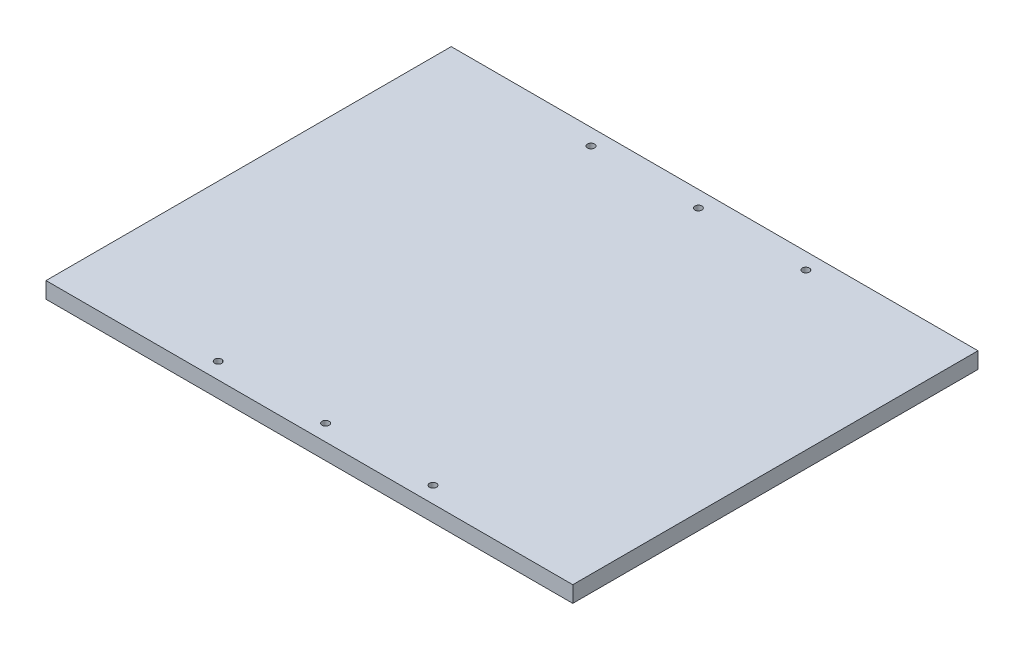
ISO-10303-21;
HEADER;
FILE_DESCRIPTION(('STEP AP214'),'2;1');
FILE_NAME('part.step','',(''),(''),'','','');
FILE_SCHEMA(('AUTOMOTIVE_DESIGN { 1 0 10303 214 1 1 1 1 }'));
ENDSEC;
DATA;
#1=APPLICATION_CONTEXT('core data for automotive mechanical design processes');
#2=APPLICATION_PROTOCOL_DEFINITION('international standard','automotive_design',2000,#1);
#3=PRODUCT_CONTEXT('',#1,'mechanical');
#4=PRODUCT('Part','Part','',(#3));
#5=PRODUCT_RELATED_PRODUCT_CATEGORY('part','',(#4));
#6=PRODUCT_DEFINITION_FORMATION('','',#4);
#7=PRODUCT_DEFINITION_CONTEXT('part definition',#1,'design');
#8=PRODUCT_DEFINITION('design','',#6,#7);
#9=PRODUCT_DEFINITION_SHAPE('','',#8);
#10=(LENGTH_UNIT() NAMED_UNIT(*) SI_UNIT(.MILLI.,.METRE.));
#11=(NAMED_UNIT(*) PLANE_ANGLE_UNIT() SI_UNIT($,.RADIAN.));
#12=(NAMED_UNIT(*) SI_UNIT($,.STERADIAN.) SOLID_ANGLE_UNIT());
#13=UNCERTAINTY_MEASURE_WITH_UNIT(LENGTH_MEASURE(1.E-05),#10,'distance_accuracy_value','');
#14=(GEOMETRIC_REPRESENTATION_CONTEXT(3) GLOBAL_UNCERTAINTY_ASSIGNED_CONTEXT((#13)) GLOBAL_UNIT_ASSIGNED_CONTEXT((#10,
#11,#12)) REPRESENTATION_CONTEXT('',''));
#15=CARTESIAN_POINT('',(0.,0.,0.));
#16=DIRECTION('',(0.,0.,1.));
#17=DIRECTION('',(1.,0.,0.));
#18=AXIS2_PLACEMENT_3D('',#15,#16,#17);
#19=CARTESIAN_POINT('',(0.,8.,0.));
#20=DIRECTION('',(0.,-1.,0.));
#21=DIRECTION('',(0.,0.,-1.));
#22=AXIS2_PLACEMENT_3D('',#19,#20,#21);
#23=PLANE('',#22);
#24=DIRECTION('',(0.,0.,-1.));
#25=VECTOR('',#24,1.);
#26=CARTESIAN_POINT('',(130.,8.,100.));
#27=LINE('',#26,#25);
#28=CARTESIAN_POINT('',(130.,8.,100.));
#29=VERTEX_POINT('',#28);
#30=CARTESIAN_POINT('',(130.,8.,-100.));
#31=VERTEX_POINT('',#30);
#32=EDGE_CURVE('E96',#29,#31,#27,.T.);
#33=ORIENTED_EDGE('',*,*,#32,.T.);
#34=DIRECTION('',(-1.,0.,0.));
#35=VECTOR('',#34,1.);
#36=CARTESIAN_POINT('',(-130.,8.,-100.));
#37=LINE('',#36,#35);
#38=CARTESIAN_POINT('',(-130.,8.,-100.));
#39=VERTEX_POINT('',#38);
#40=EDGE_CURVE('E91',#31,#39,#37,.T.);
#41=ORIENTED_EDGE('',*,*,#40,.T.);
#42=DIRECTION('',(0.,0.,1.));
#43=VECTOR('',#42,1.);
#44=CARTESIAN_POINT('',(-130.,8.,100.));
#45=LINE('',#44,#43);
#46=CARTESIAN_POINT('',(-130.,8.,100.));
#47=VERTEX_POINT('',#46);
#48=EDGE_CURVE('E94',#39,#47,#45,.T.);
#49=ORIENTED_EDGE('',*,*,#48,.T.);
#50=DIRECTION('',(1.,0.,0.));
#51=VECTOR('',#50,1.);
#52=CARTESIAN_POINT('',(-130.,8.,100.));
#53=LINE('',#52,#51);
#54=EDGE_CURVE('E61',#47,#29,#53,.T.);
#55=ORIENTED_EDGE('',*,*,#54,.T.);
#56=EDGE_LOOP('',(#33,#41,#49,#55));
#57=FACE_BOUND('',#56,.T.);
#58=CARTESIAN_POINT('',(-53.,8.,92.));
#59=DIRECTION('',(0.,1.,0.));
#60=DIRECTION('',(0.,0.,1.));
#61=AXIS2_PLACEMENT_3D('',#58,#59,#60);
#62=CIRCLE('',#61,1.75);
#63=CARTESIAN_POINT('',(-53.,8.,93.75));
#64=VERTEX_POINT('',#63);
#65=EDGE_CURVE('E116',#64,#64,#62,.T.);
#66=ORIENTED_EDGE('',*,*,#65,.F.);
#67=EDGE_LOOP('',(#66));
#68=FACE_BOUND('',#67,.T.);
#69=CARTESIAN_POINT('',(53.,8.,92.));
#70=DIRECTION('',(0.,1.,0.));
#71=DIRECTION('',(0.,0.,1.));
#72=AXIS2_PLACEMENT_3D('',#69,#70,#71);
#73=CIRCLE('',#72,1.75);
#74=CARTESIAN_POINT('',(53.,8.,93.75));
#75=VERTEX_POINT('',#74);
#76=EDGE_CURVE('E138',#75,#75,#73,.T.);
#77=ORIENTED_EDGE('',*,*,#76,.F.);
#78=EDGE_LOOP('',(#77));
#79=FACE_BOUND('',#78,.T.);
#80=CARTESIAN_POINT('',(0.,8.,92.));
#81=DIRECTION('',(0.,1.,0.));
#82=DIRECTION('',(0.,0.,1.));
#83=AXIS2_PLACEMENT_3D('',#80,#81,#82);
#84=CIRCLE('',#83,1.75);
#85=CARTESIAN_POINT('',(0.,8.,93.75));
#86=VERTEX_POINT('',#85);
#87=EDGE_CURVE('E146',#86,#86,#84,.T.);
#88=ORIENTED_EDGE('',*,*,#87,.F.);
#89=EDGE_LOOP('',(#88));
#90=FACE_BOUND('',#89,.T.);
#91=CARTESIAN_POINT('',(0.,8.,-92.));
#92=DIRECTION('',(0.,1.,0.));
#93=DIRECTION('',(0.,0.,-1.));
#94=AXIS2_PLACEMENT_3D('',#91,#92,#93);
#95=CIRCLE('',#94,1.75);
#96=CARTESIAN_POINT('',(0.,8.,-93.75));
#97=VERTEX_POINT('',#96);
#98=EDGE_CURVE('E154',#97,#97,#95,.T.);
#99=ORIENTED_EDGE('',*,*,#98,.F.);
#100=EDGE_LOOP('',(#99));
#101=FACE_BOUND('',#100,.T.);
#102=CARTESIAN_POINT('',(53.,8.,-92.));
#103=DIRECTION('',(0.,1.,0.));
#104=DIRECTION('',(0.,0.,-1.));
#105=AXIS2_PLACEMENT_3D('',#102,#103,#104);
#106=CIRCLE('',#105,1.75);
#107=CARTESIAN_POINT('',(53.,8.,-93.75));
#108=VERTEX_POINT('',#107);
#109=EDGE_CURVE('E162',#108,#108,#106,.T.);
#110=ORIENTED_EDGE('',*,*,#109,.F.);
#111=EDGE_LOOP('',(#110));
#112=FACE_BOUND('',#111,.T.);
#113=CARTESIAN_POINT('',(-53.,8.,-92.));
#114=DIRECTION('',(0.,1.,0.));
#115=DIRECTION('',(0.,0.,-1.));
#116=AXIS2_PLACEMENT_3D('',#113,#114,#115);
#117=CIRCLE('',#116,1.75);
#118=CARTESIAN_POINT('',(-53.,8.,-93.75));
#119=VERTEX_POINT('',#118);
#120=EDGE_CURVE('E170',#119,#119,#117,.T.);
#121=ORIENTED_EDGE('',*,*,#120,.F.);
#122=EDGE_LOOP('',(#121));
#123=FACE_BOUND('',#122,.T.);
#124=ADVANCED_FACE('F43',(#57,#68,#79,#90,#101,#112,#123),#23,.F.);
#125=CARTESIAN_POINT('',(0.,0.,0.));
#126=DIRECTION('',(0.,-1.,0.));
#127=DIRECTION('',(0.,0.,-1.));
#128=AXIS2_PLACEMENT_3D('',#125,#126,#127);
#129=PLANE('',#128);
#130=CARTESIAN_POINT('',(53.,0.,-92.));
#131=DIRECTION('',(0.,1.,0.));
#132=DIRECTION('',(0.,0.,-1.));
#133=AXIS2_PLACEMENT_3D('',#130,#131,#132);
#134=CIRCLE('',#133,1.75);
#135=CARTESIAN_POINT('',(53.,0.,-93.75));
#136=VERTEX_POINT('',#135);
#137=EDGE_CURVE('E166',#136,#136,#134,.T.);
#138=ORIENTED_EDGE('',*,*,#137,.T.);
#139=EDGE_LOOP('',(#138));
#140=FACE_BOUND('',#139,.T.);
#141=CARTESIAN_POINT('',(0.,0.,92.));
#142=DIRECTION('',(0.,1.,0.));
#143=DIRECTION('',(0.,0.,1.));
#144=AXIS2_PLACEMENT_3D('',#141,#142,#143);
#145=CIRCLE('',#144,1.75);
#146=CARTESIAN_POINT('',(0.,0.,93.75));
#147=VERTEX_POINT('',#146);
#148=EDGE_CURVE('E150',#147,#147,#145,.T.);
#149=ORIENTED_EDGE('',*,*,#148,.T.);
#150=EDGE_LOOP('',(#149));
#151=FACE_BOUND('',#150,.T.);
#152=CARTESIAN_POINT('',(-53.,0.,92.));
#153=DIRECTION('',(0.,1.,0.));
#154=DIRECTION('',(0.,0.,1.));
#155=AXIS2_PLACEMENT_3D('',#152,#153,#154);
#156=CIRCLE('',#155,1.75);
#157=CARTESIAN_POINT('',(-53.,0.,93.75));
#158=VERTEX_POINT('',#157);
#159=EDGE_CURVE('E134',#158,#158,#156,.T.);
#160=ORIENTED_EDGE('',*,*,#159,.T.);
#161=EDGE_LOOP('',(#160));
#162=FACE_BOUND('',#161,.T.);
#163=DIRECTION('',(0.,0.,-1.));
#164=VECTOR('',#163,1.);
#165=CARTESIAN_POINT('',(130.,0.,100.));
#166=LINE('',#165,#164);
#167=CARTESIAN_POINT('',(130.,0.,100.));
#168=VERTEX_POINT('',#167);
#169=CARTESIAN_POINT('',(130.,0.,-100.));
#170=VERTEX_POINT('',#169);
#171=EDGE_CURVE('E112',#168,#170,#166,.T.);
#172=ORIENTED_EDGE('',*,*,#171,.F.);
#173=DIRECTION('',(1.,0.,0.));
#174=VECTOR('',#173,1.);
#175=CARTESIAN_POINT('',(-130.,0.,100.));
#176=LINE('',#175,#174);
#177=CARTESIAN_POINT('',(-130.,0.,100.));
#178=VERTEX_POINT('',#177);
#179=EDGE_CURVE('E84',#178,#168,#176,.T.);
#180=ORIENTED_EDGE('',*,*,#179,.F.);
#181=DIRECTION('',(0.,0.,1.));
#182=VECTOR('',#181,1.);
#183=CARTESIAN_POINT('',(-130.,0.,100.));
#184=LINE('',#183,#182);
#185=CARTESIAN_POINT('',(-130.,0.,-100.));
#186=VERTEX_POINT('',#185);
#187=EDGE_CURVE('E78',#186,#178,#184,.T.);
#188=ORIENTED_EDGE('',*,*,#187,.F.);
#189=DIRECTION('',(-1.,0.,0.));
#190=VECTOR('',#189,1.);
#191=CARTESIAN_POINT('',(-130.,0.,-100.));
#192=LINE('',#191,#190);
#193=EDGE_CURVE('E101',#170,#186,#192,.T.);
#194=ORIENTED_EDGE('',*,*,#193,.F.);
#195=EDGE_LOOP('',(#172,#180,#188,#194));
#196=FACE_BOUND('',#195,.T.);
#197=CARTESIAN_POINT('',(53.,0.,92.));
#198=DIRECTION('',(0.,1.,0.));
#199=DIRECTION('',(0.,0.,1.));
#200=AXIS2_PLACEMENT_3D('',#197,#198,#199);
#201=CIRCLE('',#200,1.75);
#202=CARTESIAN_POINT('',(53.,0.,93.75));
#203=VERTEX_POINT('',#202);
#204=EDGE_CURVE('E142',#203,#203,#201,.T.);
#205=ORIENTED_EDGE('',*,*,#204,.T.);
#206=EDGE_LOOP('',(#205));
#207=FACE_BOUND('',#206,.T.);
#208=CARTESIAN_POINT('',(0.,0.,-92.));
#209=DIRECTION('',(0.,1.,0.));
#210=DIRECTION('',(0.,0.,-1.));
#211=AXIS2_PLACEMENT_3D('',#208,#209,#210);
#212=CIRCLE('',#211,1.75);
#213=CARTESIAN_POINT('',(0.,0.,-93.75));
#214=VERTEX_POINT('',#213);
#215=EDGE_CURVE('E158',#214,#214,#212,.T.);
#216=ORIENTED_EDGE('',*,*,#215,.T.);
#217=EDGE_LOOP('',(#216));
#218=FACE_BOUND('',#217,.T.);
#219=CARTESIAN_POINT('',(-53.,0.,-92.));
#220=DIRECTION('',(0.,1.,0.));
#221=DIRECTION('',(0.,0.,-1.));
#222=AXIS2_PLACEMENT_3D('',#219,#220,#221);
#223=CIRCLE('',#222,1.75);
#224=CARTESIAN_POINT('',(-53.,0.,-93.75));
#225=VERTEX_POINT('',#224);
#226=EDGE_CURVE('E174',#225,#225,#223,.T.);
#227=ORIENTED_EDGE('',*,*,#226,.T.);
#228=EDGE_LOOP('',(#227));
#229=FACE_BOUND('',#228,.T.);
#230=ADVANCED_FACE('F129',(#140,#151,#162,#196,#207,#218,#229),#129,.T.);
#231=CARTESIAN_POINT('',(130.,8.,100.));
#232=DIRECTION('',(-1.,0.,0.));
#233=DIRECTION('',(0.,0.,1.));
#234=AXIS2_PLACEMENT_3D('',#231,#232,#233);
#235=PLANE('',#234);
#236=ORIENTED_EDGE('',*,*,#171,.T.);
#237=DIRECTION('',(0.,-1.,0.));
#238=VECTOR('',#237,1.);
#239=CARTESIAN_POINT('',(130.,8.,-100.));
#240=LINE('',#239,#238);
#241=EDGE_CURVE('E11',#31,#170,#240,.T.);
#242=ORIENTED_EDGE('',*,*,#241,.F.);
#243=ORIENTED_EDGE('',*,*,#32,.F.);
#244=DIRECTION('',(0.,-1.,0.));
#245=VECTOR('',#244,1.);
#246=CARTESIAN_POINT('',(130.,8.,100.));
#247=LINE('',#246,#245);
#248=EDGE_CURVE('E108',#29,#168,#247,.T.);
#249=ORIENTED_EDGE('',*,*,#248,.T.);
#250=EDGE_LOOP('',(#236,#242,#243,#249));
#251=FACE_BOUND('',#250,.T.);
#252=ADVANCED_FACE('F45',(#251),#235,.F.);
#253=CARTESIAN_POINT('',(-130.,8.,-100.));
#254=DIRECTION('',(0.,0.,1.));
#255=DIRECTION('',(1.,0.,0.));
#256=AXIS2_PLACEMENT_3D('',#253,#254,#255);
#257=PLANE('',#256);
#258=ORIENTED_EDGE('',*,*,#193,.T.);
#259=DIRECTION('',(0.,-1.,0.));
#260=VECTOR('',#259,1.);
#261=CARTESIAN_POINT('',(-130.,8.,-100.));
#262=LINE('',#261,#260);
#263=EDGE_CURVE('E53',#39,#186,#262,.T.);
#264=ORIENTED_EDGE('',*,*,#263,.F.);
#265=ORIENTED_EDGE('',*,*,#40,.F.);
#266=ORIENTED_EDGE('',*,*,#241,.T.);
#267=EDGE_LOOP('',(#258,#264,#265,#266));
#268=FACE_BOUND('',#267,.T.);
#269=ADVANCED_FACE('F100',(#268),#257,.F.);
#270=CARTESIAN_POINT('',(-130.,8.,100.));
#271=DIRECTION('',(1.,0.,0.));
#272=DIRECTION('',(0.,0.,-1.));
#273=AXIS2_PLACEMENT_3D('',#270,#271,#272);
#274=PLANE('',#273);
#275=ORIENTED_EDGE('',*,*,#187,.T.);
#276=DIRECTION('',(0.,-1.,0.));
#277=VECTOR('',#276,1.);
#278=CARTESIAN_POINT('',(-130.,8.,100.));
#279=LINE('',#278,#277);
#280=EDGE_CURVE('E103',#47,#178,#279,.T.);
#281=ORIENTED_EDGE('',*,*,#280,.F.);
#282=ORIENTED_EDGE('',*,*,#48,.F.);
#283=ORIENTED_EDGE('',*,*,#263,.T.);
#284=EDGE_LOOP('',(#275,#281,#282,#283));
#285=FACE_BOUND('',#284,.T.);
#286=ADVANCED_FACE('F104',(#285),#274,.F.);
#287=CARTESIAN_POINT('',(-130.,8.,100.));
#288=DIRECTION('',(0.,0.,-1.));
#289=DIRECTION('',(-1.,0.,0.));
#290=AXIS2_PLACEMENT_3D('',#287,#288,#289);
#291=PLANE('',#290);
#292=ORIENTED_EDGE('',*,*,#179,.T.);
#293=ORIENTED_EDGE('',*,*,#248,.F.);
#294=ORIENTED_EDGE('',*,*,#54,.F.);
#295=ORIENTED_EDGE('',*,*,#280,.T.);
#296=EDGE_LOOP('',(#292,#293,#294,#295));
#297=FACE_BOUND('',#296,.T.);
#298=ADVANCED_FACE('F126',(#297),#291,.F.);
#299=CARTESIAN_POINT('',(-53.,8.,92.));
#300=DIRECTION('',(0.,-1.,0.));
#301=DIRECTION('',(0.,0.,-1.));
#302=AXIS2_PLACEMENT_3D('',#299,#300,#301);
#303=CYLINDRICAL_SURFACE('',#302,1.75);
#304=ORIENTED_EDGE('',*,*,#65,.T.);
#305=EDGE_LOOP('',(#304));
#306=FACE_BOUND('',#305,.T.);
#307=ORIENTED_EDGE('',*,*,#159,.F.);
#308=EDGE_LOOP('',(#307));
#309=FACE_BOUND('',#308,.T.);
#310=ADVANCED_FACE('F193',(#306,#309),#303,.F.);
#311=CARTESIAN_POINT('',(53.,8.,92.));
#312=DIRECTION('',(0.,-1.,0.));
#313=DIRECTION('',(0.,0.,-1.));
#314=AXIS2_PLACEMENT_3D('',#311,#312,#313);
#315=CYLINDRICAL_SURFACE('',#314,1.75);
#316=ORIENTED_EDGE('',*,*,#76,.T.);
#317=EDGE_LOOP('',(#316));
#318=FACE_BOUND('',#317,.T.);
#319=ORIENTED_EDGE('',*,*,#204,.F.);
#320=EDGE_LOOP('',(#319));
#321=FACE_BOUND('',#320,.T.);
#322=ADVANCED_FACE('F247',(#318,#321),#315,.F.);
#323=CARTESIAN_POINT('',(0.,8.,92.));
#324=DIRECTION('',(0.,-1.,0.));
#325=DIRECTION('',(0.,0.,-1.));
#326=AXIS2_PLACEMENT_3D('',#323,#324,#325);
#327=CYLINDRICAL_SURFACE('',#326,1.75);
#328=ORIENTED_EDGE('',*,*,#87,.T.);
#329=EDGE_LOOP('',(#328));
#330=FACE_BOUND('',#329,.T.);
#331=ORIENTED_EDGE('',*,*,#148,.F.);
#332=EDGE_LOOP('',(#331));
#333=FACE_BOUND('',#332,.T.);
#334=ADVANCED_FACE('F256',(#330,#333),#327,.F.);
#335=CARTESIAN_POINT('',(0.,8.,-92.));
#336=DIRECTION('',(0.,-1.,0.));
#337=DIRECTION('',(0.,0.,-1.));
#338=AXIS2_PLACEMENT_3D('',#335,#336,#337);
#339=CYLINDRICAL_SURFACE('',#338,1.75);
#340=ORIENTED_EDGE('',*,*,#98,.T.);
#341=EDGE_LOOP('',(#340));
#342=FACE_BOUND('',#341,.T.);
#343=ORIENTED_EDGE('',*,*,#215,.F.);
#344=EDGE_LOOP('',(#343));
#345=FACE_BOUND('',#344,.T.);
#346=ADVANCED_FACE('F265',(#342,#345),#339,.F.);
#347=CARTESIAN_POINT('',(53.,8.,-92.));
#348=DIRECTION('',(0.,-1.,0.));
#349=DIRECTION('',(0.,0.,-1.));
#350=AXIS2_PLACEMENT_3D('',#347,#348,#349);
#351=CYLINDRICAL_SURFACE('',#350,1.75);
#352=ORIENTED_EDGE('',*,*,#109,.T.);
#353=EDGE_LOOP('',(#352));
#354=FACE_BOUND('',#353,.T.);
#355=ORIENTED_EDGE('',*,*,#137,.F.);
#356=EDGE_LOOP('',(#355));
#357=FACE_BOUND('',#356,.T.);
#358=ADVANCED_FACE('F275',(#354,#357),#351,.F.);
#359=CARTESIAN_POINT('',(-53.,8.,-92.));
#360=DIRECTION('',(0.,-1.,0.));
#361=DIRECTION('',(0.,0.,-1.));
#362=AXIS2_PLACEMENT_3D('',#359,#360,#361);
#363=CYLINDRICAL_SURFACE('',#362,1.75);
#364=ORIENTED_EDGE('',*,*,#120,.T.);
#365=EDGE_LOOP('',(#364));
#366=FACE_BOUND('',#365,.T.);
#367=ORIENTED_EDGE('',*,*,#226,.F.);
#368=EDGE_LOOP('',(#367));
#369=FACE_BOUND('',#368,.T.);
#370=ADVANCED_FACE('F182',(#366,#369),#363,.F.);
#371=CLOSED_SHELL('',(#124,#230,#252,#269,#286,#298,#310,#322,#334,#346,#358,#370));
#372=MANIFOLD_SOLID_BREP('B2',#371);
#373=ADVANCED_BREP_SHAPE_REPRESENTATION('',(#18,#372),#14);
#374=SHAPE_DEFINITION_REPRESENTATION(#9,#373);
ENDSEC;
END-ISO-10303-21;
